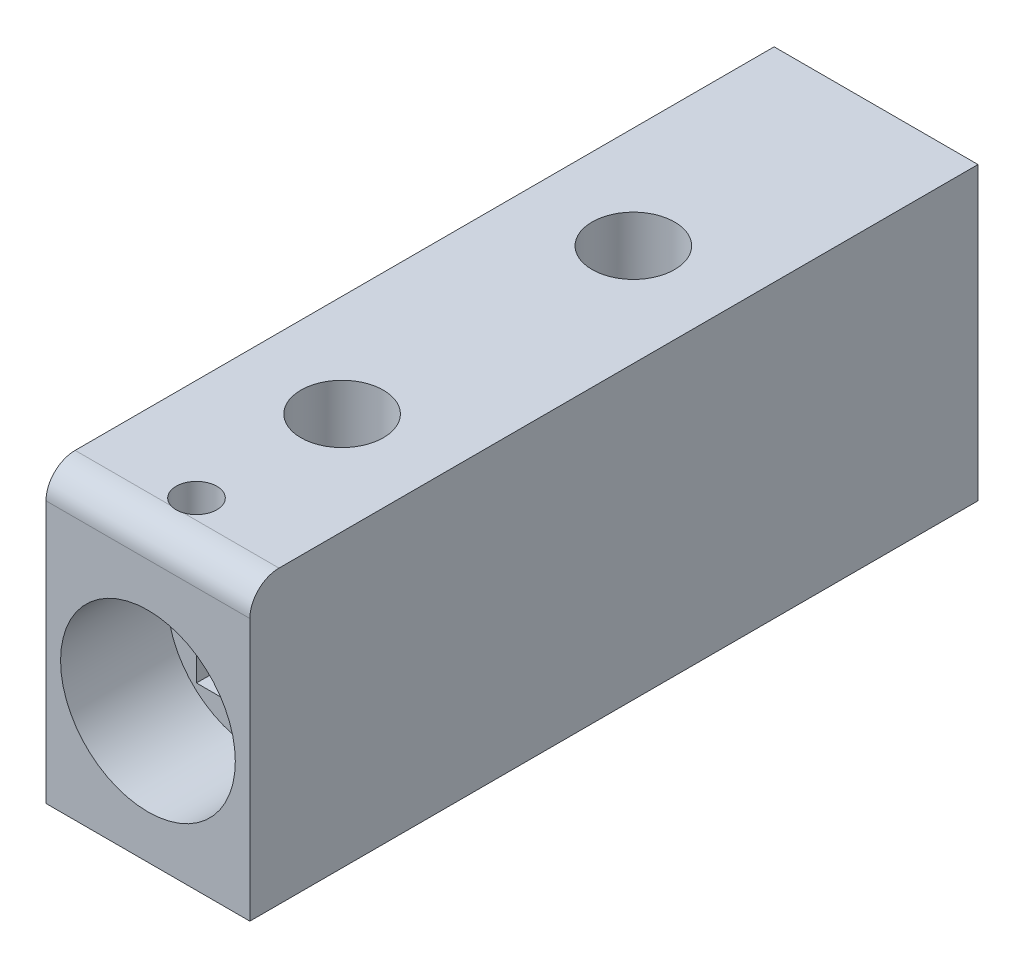
ISO-10303-21;
HEADER;
FILE_DESCRIPTION(('STEP AP214'),'2;1');
FILE_NAME('part.step','',(''),(''),'','','');
FILE_SCHEMA(('AUTOMOTIVE_DESIGN { 1 0 10303 214 1 1 1 1 }'));
ENDSEC;
DATA;
#1=APPLICATION_CONTEXT('core data for automotive mechanical design processes');
#2=APPLICATION_PROTOCOL_DEFINITION('international standard','automotive_design',2000,#1);
#3=PRODUCT_CONTEXT('',#1,'mechanical');
#4=PRODUCT('Part','Part','',(#3));
#5=PRODUCT_RELATED_PRODUCT_CATEGORY('part','',(#4));
#6=PRODUCT_DEFINITION_FORMATION('','',#4);
#7=PRODUCT_DEFINITION_CONTEXT('part definition',#1,'design');
#8=PRODUCT_DEFINITION('design','',#6,#7);
#9=PRODUCT_DEFINITION_SHAPE('','',#8);
#10=(LENGTH_UNIT() NAMED_UNIT(*) SI_UNIT(.MILLI.,.METRE.));
#11=(NAMED_UNIT(*) PLANE_ANGLE_UNIT() SI_UNIT($,.RADIAN.));
#12=(NAMED_UNIT(*) SI_UNIT($,.STERADIAN.) SOLID_ANGLE_UNIT());
#13=UNCERTAINTY_MEASURE_WITH_UNIT(LENGTH_MEASURE(1.E-05),#10,'distance_accuracy_value','');
#14=(GEOMETRIC_REPRESENTATION_CONTEXT(3) GLOBAL_UNCERTAINTY_ASSIGNED_CONTEXT((#13)) GLOBAL_UNIT_ASSIGNED_CONTEXT((#10,
#11,#12)) REPRESENTATION_CONTEXT('',''));
#15=CARTESIAN_POINT('',(0.,0.,0.));
#16=DIRECTION('',(0.,0.,1.));
#17=DIRECTION('',(1.,0.,0.));
#18=AXIS2_PLACEMENT_3D('',#15,#16,#17);
#19=CARTESIAN_POINT('',(10.5,30.,-75.));
#20=DIRECTION('',(1.,0.,0.));
#21=DIRECTION('',(0.,1.,0.));
#22=AXIS2_PLACEMENT_3D('',#19,#20,#21);
#23=PLANE('',#22);
#24=DIRECTION('',(0.,0.,1.));
#25=VECTOR('',#24,1.);
#26=CARTESIAN_POINT('',(10.5,30.,-75.));
#27=LINE('',#26,#25);
#28=CARTESIAN_POINT('',(10.5,30.,-75.));
#29=VERTEX_POINT('',#28);
#30=CARTESIAN_POINT('',(10.5,30.,-3.));
#31=VERTEX_POINT('',#30);
#32=EDGE_CURVE('E146',#29,#31,#27,.T.);
#33=ORIENTED_EDGE('',*,*,#32,.T.);
#34=CARTESIAN_POINT('',(10.5,27.,-3.));
#35=DIRECTION('',(1.,0.,0.));
#36=DIRECTION('',(0.,1.,0.));
#37=AXIS2_PLACEMENT_3D('',#34,#35,#36);
#38=CIRCLE('',#37,3.);
#39=CARTESIAN_POINT('',(10.5,27.,0.));
#40=VERTEX_POINT('',#39);
#41=EDGE_CURVE('E11',#31,#40,#38,.T.);
#42=ORIENTED_EDGE('',*,*,#41,.T.);
#43=DIRECTION('',(0.,1.,0.));
#44=VECTOR('',#43,1.);
#45=CARTESIAN_POINT('',(10.5,30.,0.));
#46=LINE('',#45,#44);
#47=CARTESIAN_POINT('',(10.5,0.,0.));
#48=VERTEX_POINT('',#47);
#49=EDGE_CURVE('E144',#48,#40,#46,.T.);
#50=ORIENTED_EDGE('',*,*,#49,.F.);
#51=DIRECTION('',(0.,0.,1.));
#52=VECTOR('',#51,1.);
#53=CARTESIAN_POINT('',(10.5,0.,-75.));
#54=LINE('',#53,#52);
#55=CARTESIAN_POINT('',(10.5,0.,-75.));
#56=VERTEX_POINT('',#55);
#57=EDGE_CURVE('E140',#56,#48,#54,.T.);
#58=ORIENTED_EDGE('',*,*,#57,.F.);
#59=DIRECTION('',(0.,1.,0.));
#60=VECTOR('',#59,1.);
#61=CARTESIAN_POINT('',(10.5,30.,-75.));
#62=LINE('',#61,#60);
#63=EDGE_CURVE('E158',#56,#29,#62,.T.);
#64=ORIENTED_EDGE('',*,*,#63,.T.);
#65=EDGE_LOOP('',(#33,#42,#50,#58,#64));
#66=FACE_BOUND('',#65,.T.);
#67=ADVANCED_FACE('F45',(#66),#23,.T.);
#68=CARTESIAN_POINT('',(-10.5,0.,-75.));
#69=DIRECTION('',(0.,-1.,0.));
#70=DIRECTION('',(1.,0.,0.));
#71=AXIS2_PLACEMENT_3D('',#68,#69,#70);
#72=PLANE('',#71);
#73=DIRECTION('',(1.,0.,0.));
#74=VECTOR('',#73,1.);
#75=CARTESIAN_POINT('',(-10.5,0.,0.));
#76=LINE('',#75,#74);
#77=CARTESIAN_POINT('',(-10.5,0.,0.));
#78=VERTEX_POINT('',#77);
#79=EDGE_CURVE('E155',#78,#48,#76,.T.);
#80=ORIENTED_EDGE('',*,*,#79,.F.);
#81=DIRECTION('',(0.,0.,1.));
#82=VECTOR('',#81,1.);
#83=CARTESIAN_POINT('',(-10.5,0.,-75.));
#84=LINE('',#83,#82);
#85=CARTESIAN_POINT('',(-10.5,0.,-75.));
#86=VERTEX_POINT('',#85);
#87=EDGE_CURVE('E151',#86,#78,#84,.T.);
#88=ORIENTED_EDGE('',*,*,#87,.F.);
#89=DIRECTION('',(1.,0.,0.));
#90=VECTOR('',#89,1.);
#91=CARTESIAN_POINT('',(-10.5,0.,-75.));
#92=LINE('',#91,#90);
#93=EDGE_CURVE('E149',#86,#56,#92,.T.);
#94=ORIENTED_EDGE('',*,*,#93,.T.);
#95=ORIENTED_EDGE('',*,*,#57,.T.);
#96=EDGE_LOOP('',(#80,#88,#94,#95));
#97=FACE_BOUND('',#96,.T.);
#98=ADVANCED_FACE('F255',(#97),#72,.T.);
#99=CARTESIAN_POINT('',(-10.5,30.,-75.));
#100=DIRECTION('',(-1.,0.,0.));
#101=DIRECTION('',(0.,-1.,0.));
#102=AXIS2_PLACEMENT_3D('',#99,#100,#101);
#103=PLANE('',#102);
#104=DIRECTION('',(0.,-1.,0.));
#105=VECTOR('',#104,1.);
#106=CARTESIAN_POINT('',(-10.5,30.,0.));
#107=LINE('',#106,#105);
#108=CARTESIAN_POINT('',(-10.5,27.,0.));
#109=VERTEX_POINT('',#108);
#110=EDGE_CURVE('E159',#109,#78,#107,.T.);
#111=ORIENTED_EDGE('',*,*,#110,.F.);
#112=CARTESIAN_POINT('',(-10.5,27.,-3.));
#113=DIRECTION('',(-1.,0.,0.));
#114=DIRECTION('',(0.,-1.,0.));
#115=AXIS2_PLACEMENT_3D('',#112,#113,#114);
#116=CIRCLE('',#115,3.);
#117=CARTESIAN_POINT('',(-10.5,30.,-3.));
#118=VERTEX_POINT('',#117);
#119=EDGE_CURVE('E134',#109,#118,#116,.T.);
#120=ORIENTED_EDGE('',*,*,#119,.T.);
#121=DIRECTION('',(0.,0.,1.));
#122=VECTOR('',#121,1.);
#123=CARTESIAN_POINT('',(-10.5,30.,-75.));
#124=LINE('',#123,#122);
#125=CARTESIAN_POINT('',(-10.5,30.,-75.));
#126=VERTEX_POINT('',#125);
#127=EDGE_CURVE('E148',#126,#118,#124,.T.);
#128=ORIENTED_EDGE('',*,*,#127,.F.);
#129=DIRECTION('',(0.,-1.,0.));
#130=VECTOR('',#129,1.);
#131=CARTESIAN_POINT('',(-10.5,30.,-75.));
#132=LINE('',#131,#130);
#133=EDGE_CURVE('E165',#126,#86,#132,.T.);
#134=ORIENTED_EDGE('',*,*,#133,.T.);
#135=ORIENTED_EDGE('',*,*,#87,.T.);
#136=EDGE_LOOP('',(#111,#120,#128,#134,#135));
#137=FACE_BOUND('',#136,.T.);
#138=ADVANCED_FACE('F258',(#137),#103,.T.);
#139=CARTESIAN_POINT('',(-10.5,30.,-75.));
#140=DIRECTION('',(0.,1.,0.));
#141=DIRECTION('',(-1.,0.,0.));
#142=AXIS2_PLACEMENT_3D('',#139,#140,#141);
#143=PLANE('',#142);
#144=CARTESIAN_POINT('',(0.,30.,-20.));
#145=DIRECTION('',(0.,1.,0.));
#146=DIRECTION('',(0.,0.,1.));
#147=AXIS2_PLACEMENT_3D('',#144,#145,#146);
#148=CIRCLE('',#147,4.25);
#149=CARTESIAN_POINT('',(0.,30.,-15.75));
#150=VERTEX_POINT('',#149);
#151=EDGE_CURVE('E401',#150,#150,#148,.T.);
#152=ORIENTED_EDGE('',*,*,#151,.F.);
#153=EDGE_LOOP('',(#152));
#154=FACE_BOUND('',#153,.T.);
#155=CARTESIAN_POINT('',(0.,30.,-50.));
#156=DIRECTION('',(0.,1.,0.));
#157=DIRECTION('',(0.,0.,1.));
#158=AXIS2_PLACEMENT_3D('',#155,#156,#157);
#159=CIRCLE('',#158,4.25);
#160=CARTESIAN_POINT('',(0.,30.,-45.75));
#161=VERTEX_POINT('',#160);
#162=EDGE_CURVE('E403',#161,#161,#159,.T.);
#163=ORIENTED_EDGE('',*,*,#162,.F.);
#164=EDGE_LOOP('',(#163));
#165=FACE_BOUND('',#164,.T.);
#166=CARTESIAN_POINT('',(0.,30.,-5.));
#167=DIRECTION('',(0.,1.,0.));
#168=DIRECTION('',(0.,0.,1.));
#169=AXIS2_PLACEMENT_3D('',#166,#167,#168);
#170=CIRCLE('',#169,2.1);
#171=CARTESIAN_POINT('',(0.640312423743279,30.,-3.));
#172=VERTEX_POINT('',#171);
#173=CARTESIAN_POINT('',(-0.64031242374329,30.,-3.));
#174=VERTEX_POINT('',#173);
#175=EDGE_CURVE('E60',#172,#174,#170,.T.);
#176=ORIENTED_EDGE('',*,*,#175,.F.);
#177=DIRECTION('',(-1.,0.,0.));
#178=VECTOR('',#177,1.);
#179=CARTESIAN_POINT('',(-10.5,30.,-3.));
#180=LINE('',#179,#178);
#181=EDGE_CURVE('E67',#172,#31,#180,.F.);
#182=ORIENTED_EDGE('',*,*,#181,.T.);
#183=ORIENTED_EDGE('',*,*,#32,.F.);
#184=DIRECTION('',(-1.,0.,0.));
#185=VECTOR('',#184,1.);
#186=CARTESIAN_POINT('',(-10.5,30.,-75.));
#187=LINE('',#186,#185);
#188=EDGE_CURVE('E168',#29,#126,#187,.T.);
#189=ORIENTED_EDGE('',*,*,#188,.T.);
#190=ORIENTED_EDGE('',*,*,#127,.T.);
#191=EDGE_CURVE('E54',#118,#174,#180,.F.);
#192=ORIENTED_EDGE('',*,*,#191,.T.);
#193=EDGE_LOOP('',(#176,#182,#183,#189,#190,#192));
#194=FACE_BOUND('',#193,.T.);
#195=ADVANCED_FACE('F128',(#154,#165,#194),#143,.T.);
#196=CARTESIAN_POINT('',(0.,0.,-75.));
#197=DIRECTION('',(0.,0.,1.));
#198=DIRECTION('',(1.,0.,0.));
#199=AXIS2_PLACEMENT_3D('',#196,#197,#198);
#200=PLANE('',#199);
#201=DIRECTION('',(1.,0.,0.));
#202=VECTOR('',#201,1.);
#203=CARTESIAN_POINT('',(-6.,7.5,-75.));
#204=LINE('',#203,#202);
#205=CARTESIAN_POINT('',(-6.,7.5,-75.));
#206=VERTEX_POINT('',#205);
#207=CARTESIAN_POINT('',(6.,7.5,-75.));
#208=VERTEX_POINT('',#207);
#209=EDGE_CURVE('E179',#206,#208,#204,.T.);
#210=ORIENTED_EDGE('',*,*,#209,.T.);
#211=DIRECTION('',(0.,1.,0.));
#212=VECTOR('',#211,1.);
#213=CARTESIAN_POINT('',(6.,7.5,-75.));
#214=LINE('',#213,#212);
#215=CARTESIAN_POINT('',(6.,19.5,-75.));
#216=VERTEX_POINT('',#215);
#217=EDGE_CURVE('E188',#208,#216,#214,.T.);
#218=ORIENTED_EDGE('',*,*,#217,.T.);
#219=DIRECTION('',(-1.,0.,0.));
#220=VECTOR('',#219,1.);
#221=CARTESIAN_POINT('',(-6.,19.5,-75.));
#222=LINE('',#221,#220);
#223=CARTESIAN_POINT('',(-6.,19.5,-75.));
#224=VERTEX_POINT('',#223);
#225=EDGE_CURVE('E201',#216,#224,#222,.T.);
#226=ORIENTED_EDGE('',*,*,#225,.T.);
#227=DIRECTION('',(0.,-1.,0.));
#228=VECTOR('',#227,1.);
#229=CARTESIAN_POINT('',(-6.,7.5,-75.));
#230=LINE('',#229,#228);
#231=EDGE_CURVE('E198',#224,#206,#230,.T.);
#232=ORIENTED_EDGE('',*,*,#231,.T.);
#233=EDGE_LOOP('',(#210,#218,#226,#232));
#234=FACE_BOUND('',#233,.T.);
#235=ORIENTED_EDGE('',*,*,#63,.F.);
#236=ORIENTED_EDGE('',*,*,#93,.F.);
#237=ORIENTED_EDGE('',*,*,#133,.F.);
#238=ORIENTED_EDGE('',*,*,#188,.F.);
#239=EDGE_LOOP('',(#235,#236,#237,#238));
#240=FACE_BOUND('',#239,.T.);
#241=ADVANCED_FACE('F248',(#234,#240),#200,.F.);
#242=CARTESIAN_POINT('',(0.,0.,0.));
#243=DIRECTION('',(0.,0.,1.));
#244=DIRECTION('',(1.,0.,0.));
#245=AXIS2_PLACEMENT_3D('',#242,#243,#244);
#246=PLANE('',#245);
#247=CARTESIAN_POINT('',(0.,13.5,0.));
#248=DIRECTION('',(0.,0.,1.));
#249=DIRECTION('',(1.,0.,0.));
#250=AXIS2_PLACEMENT_3D('',#247,#248,#249);
#251=CIRCLE('',#250,9.);
#252=CARTESIAN_POINT('',(9.,13.5,0.));
#253=VERTEX_POINT('',#252);
#254=EDGE_CURVE('E141',#253,#253,#251,.F.);
#255=ORIENTED_EDGE('',*,*,#254,.T.);
#256=EDGE_LOOP('',(#255));
#257=FACE_BOUND('',#256,.T.);
#258=ORIENTED_EDGE('',*,*,#49,.T.);
#259=DIRECTION('',(-1.,0.,0.));
#260=VECTOR('',#259,1.);
#261=CARTESIAN_POINT('',(0.,27.,0.));
#262=LINE('',#261,#260);
#263=EDGE_CURVE('E135',#40,#109,#262,.T.);
#264=ORIENTED_EDGE('',*,*,#263,.T.);
#265=ORIENTED_EDGE('',*,*,#110,.T.);
#266=ORIENTED_EDGE('',*,*,#79,.T.);
#267=EDGE_LOOP('',(#258,#264,#265,#266));
#268=FACE_BOUND('',#267,.T.);
#269=ADVANCED_FACE('F246',(#257,#268),#246,.T.);
#270=CARTESIAN_POINT('',(0.,13.5,1.2E-05));
#271=DIRECTION('',(0.,0.,-1.));
#272=DIRECTION('',(-1.,0.,0.));
#273=AXIS2_PLACEMENT_3D('',#270,#271,#272);
#274=CYLINDRICAL_SURFACE('',#273,9.);
#275=CARTESIAN_POINT('',(0.,22.5,-2.9));
#276=CARTESIAN_POINT('',(-0.116270482771296,22.4999979069311,-2.90000367425328));
#277=CARTESIAN_POINT('',(-0.232583778270632,22.49772416581,-2.90968886156538));
#278=CARTESIAN_POINT('',(-0.461893067534111,22.4888736766601,-2.94812549196073));
#279=CARTESIAN_POINT('',(-0.574886863108166,22.4822941415624,-2.97688928447222));
#280=CARTESIAN_POINT('',(-0.794211203729724,22.4655628470686,-3.05252253463005));
#281=CARTESIAN_POINT('',(-0.900549030839804,22.4554150749746,-3.0993717884954));
#282=CARTESIAN_POINT('',(-1.10385368433182,22.4326359579363,-3.20977874892187));
#283=CARTESIAN_POINT('',(-1.20082049651012,22.4200046092278,-3.27333648080746));
#284=CARTESIAN_POINT('',(-1.38438893887319,22.3933806608296,-3.4165735399717));
#285=CARTESIAN_POINT('',(-1.47079656869454,22.3793692790304,-3.49649801925577));
#286=CARTESIAN_POINT('',(-1.62910985770604,22.3516932992599,-3.66967415465357));
#287=CARTESIAN_POINT('',(-1.70101407589094,22.3380287358648,-3.76292713346646));
#288=CARTESIAN_POINT('',(-1.82916077598461,22.3124065725647,-3.96158002557307));
#289=CARTESIAN_POINT('',(-1.88519200065477,22.3004729438296,-4.06711958648676));
#290=CARTESIAN_POINT('',(-1.97864555557152,22.2799354518056,-4.28644203310331));
#291=CARTESIAN_POINT('',(-2.01607044443044,22.27133113073,-4.40022378293157));
#292=CARTESIAN_POINT('',(-2.07059844665284,22.2586185938141,-4.63068292650073));
#293=CARTESIAN_POINT('',(-2.08804750528012,22.2544339394324,-4.74727415734885));
#294=CARTESIAN_POINT('',(-2.10320509139726,22.2508053257674,-4.98179841333567));
#295=CARTESIAN_POINT('',(-2.10091639510568,22.2513606997742,-5.0997312474405));
#296=CARTESIAN_POINT('',(-2.0769407551021,22.2570804091111,-5.33098384571856));
#297=CARTESIAN_POINT('',(-2.05566028697392,22.2621481620844,-5.44434850795902));
#298=CARTESIAN_POINT('',(-1.99495115818445,22.2761683747317,-5.66585278940971));
#299=CARTESIAN_POINT('',(-1.9555213543927,22.2851210790961,-5.7739920790273));
#300=CARTESIAN_POINT('',(-1.85927182963291,22.3059946594555,-5.98309472734648));
#301=CARTESIAN_POINT('',(-1.80229980082799,22.317941354253,-6.08398529397549));
#302=CARTESIAN_POINT('',(-1.67268987149991,22.3434415694815,-6.27492266915778));
#303=CARTESIAN_POINT('',(-1.6000495591666,22.3569953371435,-6.36496780495079));
#304=CARTESIAN_POINT('',(-1.43903418153237,22.3845934658101,-6.53399373688632));
#305=CARTESIAN_POINT('',(-1.35031462598566,22.3986416731073,-6.61264610513689));
#306=CARTESIAN_POINT('',(-1.16078098583346,22.4253421360926,-6.75401378684927));
#307=CARTESIAN_POINT('',(-1.05996661948874,22.4379943592492,-6.81672872895493));
#308=CARTESIAN_POINT('',(-0.848673760476629,22.4605276999368,-6.92454003763603));
#309=CARTESIAN_POINT('',(-0.738170088604823,22.4704012989627,-6.96958872922549));
#310=CARTESIAN_POINT('',(-0.510878422765306,22.4862096792902,-7.04038356719761));
#311=CARTESIAN_POINT('',(-0.394091475459281,22.4921451144245,-7.06613291784047));
#312=CARTESIAN_POINT('',(-0.160361382690048,22.4993136660416,-7.09710970449861));
#313=CARTESIAN_POINT('',(-0.0434806749828665,22.5006494157481,-7.10278513142171));
#314=CARTESIAN_POINT('',(0.18955926829311,22.4987578257406,-7.09467374805388));
#315=CARTESIAN_POINT('',(0.305718559246018,22.4955308407741,-7.0808884508126));
#316=CARTESIAN_POINT('',(0.532501284230128,22.4849416028821,-7.03461754245816));
#317=CARTESIAN_POINT('',(0.643176222996088,22.4776322819214,-7.00237116803738));
#318=CARTESIAN_POINT('',(0.857543849316164,22.4596986028195,-6.92036247894844));
#319=CARTESIAN_POINT('',(0.961235887574998,22.4490739369216,-6.87059853810544));
#320=CARTESIAN_POINT('',(1.16051529844914,22.4254379376066,-6.7540635476818));
#321=CARTESIAN_POINT('',(1.25594772133985,22.4123913653529,-6.68703484021642));
#322=CARTESIAN_POINT('',(1.43437018543801,22.3854228141331,-6.53820771835372));
#323=CARTESIAN_POINT('',(1.51735836809635,22.3715007048451,-6.45640710178295));
#324=CARTESIAN_POINT('',(1.67034215780755,22.3439888047978,-6.27829055668902));
#325=CARTESIAN_POINT('',(1.74002558845952,22.3304122848168,-6.18170404580447));
#326=CARTESIAN_POINT('',(1.86218801628622,22.305461868571,-5.97793878253686));
#327=CARTESIAN_POINT('',(1.91466778097558,22.2940878740533,-5.87076050296671));
#328=CARTESIAN_POINT('',(2.00055801810582,22.2749475819543,-5.64943931000558));
#329=CARTESIAN_POINT('',(2.03407988610504,22.2671602605551,-5.53534153729492));
#330=CARTESIAN_POINT('',(2.08141649114138,22.2560440588381,-5.30292427437427));
#331=CARTESIAN_POINT('',(2.09523488954185,22.252714350199,-5.1846055727008));
#332=CARTESIAN_POINT('',(2.10260008651045,22.2509476002078,-4.95026517575));
#333=CARTESIAN_POINT('',(2.09664352415427,22.2523906887767,-4.83425972532685));
#334=CARTESIAN_POINT('',(2.06575006242284,22.2597331022539,-4.60495544031369));
#335=CARTESIAN_POINT('',(2.04081345391001,22.2656323588731,-4.49165656427384));
#336=CARTESIAN_POINT('',(1.97292227427207,22.2811601012467,-4.27144176430943));
#337=CARTESIAN_POINT('',(1.93004943720438,22.2907716552704,-4.16449936782233));
#338=CARTESIAN_POINT('',(1.82756980261904,22.3126455601281,-3.95925500607232));
#339=CARTESIAN_POINT('',(1.76796099211833,22.3249082297943,-3.86095408206424));
#340=CARTESIAN_POINT('',(1.63209515201212,22.3510534148006,-3.67335634537734));
#341=CARTESIAN_POINT('',(1.55548832622459,22.3649665796007,-3.58431709386511));
#342=CARTESIAN_POINT('',(1.3884978569793,22.3926499650442,-3.42019540758775));
#343=CARTESIAN_POINT('',(1.29811100193217,22.4064201515637,-3.34511623545214));
#344=CARTESIAN_POINT('',(1.10446706420138,22.4325153682366,-3.20994228107424));
#345=CARTESIAN_POINT('',(1.00103507802072,22.4448152212635,-3.15009287915445));
#346=CARTESIAN_POINT('',(0.785307395531293,22.4663260221027,-3.04872564707065));
#347=CARTESIAN_POINT('',(0.673018734058403,22.4755393915764,-3.00719343706313));
#348=CARTESIAN_POINT('',(0.467292276271287,22.4883208873433,-2.95048967659163));
#349=CARTESIAN_POINT('',(0.374911422864423,22.4926721191901,-2.93159427817839));
#350=CARTESIAN_POINT('',(0.188363011400006,22.4985124419216,-2.90634830849423));
#351=CARTESIAN_POINT('',(0.0941955553264274,22.5000016956821,-2.89999702333456));
#352=CARTESIAN_POINT('',(0.,22.5,-2.9));
#353=B_SPLINE_CURVE_WITH_KNOTS('',3,(#275,#276,#277,#278,#279,#280,#281,#282,#283,#284,#285,
#286,#287,#288,#289,#290,#291,#292,#293,#294,#295,#296,#297,#298,#299,#300,#301,#302,#303,#304,
#305,#306,#307,#308,#309,#310,#311,#312,#313,#314,#315,#316,#317,#318,#319,#320,#321,#322,#323,
#324,#325,#326,#327,#328,#329,#330,#331,#332,#333,#334,#335,#336,#337,#338,#339,#340,#341,#342,
#343,#344,#345,#346,#347,#348,#349,#350,#351,#352),.UNSPECIFIED.,.T.,.F.,(4,2,2,2,2,2,2,2,2,2,2,
2,2,2,2,2,2,2,2,2,2,2,2,2,2,2,2,2,2,2,2,2,2,2,2,2,2,2,4),(0.,0.348466478879037,
0.697158737725428,1.04546258459426,1.39376695937821,1.74773027157475,2.10172873495005,
2.46023827430178,2.81869850030005,3.17085218877342,3.52295634579486,3.86770057789557,
4.21246652658029,4.56031454541877,4.9082161465687,5.26471547109128,5.62122310160243,
5.97868630678437,6.33609014936903,6.68546563108269,7.03481395073765,7.37973436244265,
7.72468680193442,8.0751200868535,8.42560565701933,8.7835095384404,9.14139745036613,
9.49715998077892,9.85285639361189,10.1996879051154,10.5465141016571,10.8917767616241,
11.2370809671781,11.5902879607255,11.9435773992963,12.3022423880077,12.6606253047182,
12.9429485641595,13.2252557560478),.UNSPECIFIED.);
#354=CARTESIAN_POINT('',(0.,22.5,-2.9));
#355=VERTEX_POINT('',#354);
#356=EDGE_CURVE('E126',#355,#355,#353,.T.);
#357=ORIENTED_EDGE('',*,*,#356,.F.);
#358=EDGE_LOOP('',(#357));
#359=FACE_BOUND('',#358,.T.);
#360=ORIENTED_EDGE('',*,*,#254,.F.);
#361=EDGE_LOOP('',(#360));
#362=FACE_BOUND('',#361,.T.);
#363=CARTESIAN_POINT('',(0.,13.5,-11.));
#364=DIRECTION('',(0.,0.,1.));
#365=DIRECTION('',(1.,0.,0.));
#366=AXIS2_PLACEMENT_3D('',#363,#364,#365);
#367=CIRCLE('',#366,9.);
#368=CARTESIAN_POINT('',(9.,13.5,-11.));
#369=VERTEX_POINT('',#368);
#370=EDGE_CURVE('E145',#369,#369,#367,.T.);
#371=ORIENTED_EDGE('',*,*,#370,.F.);
#372=EDGE_LOOP('',(#371));
#373=FACE_BOUND('',#372,.T.);
#374=ADVANCED_FACE('F242',(#359,#362,#373),#274,.F.);
#375=CARTESIAN_POINT('',(0.,13.5,-11.));
#376=DIRECTION('',(0.,0.,1.));
#377=DIRECTION('',(1.,0.,0.));
#378=AXIS2_PLACEMENT_3D('',#375,#376,#377);
#379=PLANE('',#378);
#380=DIRECTION('',(0.,1.,0.));
#381=VECTOR('',#380,1.);
#382=CARTESIAN_POINT('',(6.,7.5,-11.));
#383=LINE('',#382,#381);
#384=CARTESIAN_POINT('',(6.,7.5,-11.));
#385=VERTEX_POINT('',#384);
#386=CARTESIAN_POINT('',(6.,19.5,-11.));
#387=VERTEX_POINT('',#386);
#388=EDGE_CURVE('E125',#385,#387,#383,.T.);
#389=ORIENTED_EDGE('',*,*,#388,.F.);
#390=DIRECTION('',(1.,0.,0.));
#391=VECTOR('',#390,1.);
#392=CARTESIAN_POINT('',(-6.,7.5,-11.));
#393=LINE('',#392,#391);
#394=CARTESIAN_POINT('',(-6.,7.5,-11.));
#395=VERTEX_POINT('',#394);
#396=EDGE_CURVE('E185',#395,#385,#393,.T.);
#397=ORIENTED_EDGE('',*,*,#396,.F.);
#398=DIRECTION('',(0.,-1.,0.));
#399=VECTOR('',#398,1.);
#400=CARTESIAN_POINT('',(-6.,7.5,-11.));
#401=LINE('',#400,#399);
#402=CARTESIAN_POINT('',(-6.,19.5,-11.));
#403=VERTEX_POINT('',#402);
#404=EDGE_CURVE('E189',#403,#395,#401,.T.);
#405=ORIENTED_EDGE('',*,*,#404,.F.);
#406=DIRECTION('',(-1.,0.,0.));
#407=VECTOR('',#406,1.);
#408=CARTESIAN_POINT('',(-6.,19.5,-11.));
#409=LINE('',#408,#407);
#410=EDGE_CURVE('E191',#387,#403,#409,.T.);
#411=ORIENTED_EDGE('',*,*,#410,.F.);
#412=EDGE_LOOP('',(#389,#397,#405,#411));
#413=FACE_BOUND('',#412,.T.);
#414=ORIENTED_EDGE('',*,*,#370,.T.);
#415=EDGE_LOOP('',(#414));
#416=FACE_BOUND('',#415,.T.);
#417=ADVANCED_FACE('F238',(#413,#416),#379,.T.);
#418=CARTESIAN_POINT('',(6.,7.5,-75.));
#419=DIRECTION('',(1.,0.,0.));
#420=DIRECTION('',(0.,1.,0.));
#421=AXIS2_PLACEMENT_3D('',#418,#419,#420);
#422=PLANE('',#421);
#423=ORIENTED_EDGE('',*,*,#388,.T.);
#424=DIRECTION('',(0.,0.,1.));
#425=VECTOR('',#424,1.);
#426=CARTESIAN_POINT('',(6.,19.5,-75.));
#427=LINE('',#426,#425);
#428=EDGE_CURVE('E176',#216,#387,#427,.T.);
#429=ORIENTED_EDGE('',*,*,#428,.F.);
#430=ORIENTED_EDGE('',*,*,#217,.F.);
#431=DIRECTION('',(0.,0.,1.));
#432=VECTOR('',#431,1.);
#433=CARTESIAN_POINT('',(6.,7.5,-75.));
#434=LINE('',#433,#432);
#435=EDGE_CURVE('E175',#208,#385,#434,.T.);
#436=ORIENTED_EDGE('',*,*,#435,.T.);
#437=EDGE_LOOP('',(#423,#429,#430,#436));
#438=FACE_BOUND('',#437,.T.);
#439=ADVANCED_FACE('F227',(#438),#422,.F.);
#440=CARTESIAN_POINT('',(-6.,7.5,-75.));
#441=DIRECTION('',(0.,-1.,0.));
#442=DIRECTION('',(1.,0.,0.));
#443=AXIS2_PLACEMENT_3D('',#440,#441,#442);
#444=PLANE('',#443);
#445=ORIENTED_EDGE('',*,*,#396,.T.);
#446=ORIENTED_EDGE('',*,*,#435,.F.);
#447=ORIENTED_EDGE('',*,*,#209,.F.);
#448=DIRECTION('',(0.,0.,1.));
#449=VECTOR('',#448,1.);
#450=CARTESIAN_POINT('',(-6.,7.5,-75.));
#451=LINE('',#450,#449);
#452=EDGE_CURVE('E181',#206,#395,#451,.T.);
#453=ORIENTED_EDGE('',*,*,#452,.T.);
#454=EDGE_LOOP('',(#445,#446,#447,#453));
#455=FACE_BOUND('',#454,.T.);
#456=ADVANCED_FACE('F223',(#455),#444,.F.);
#457=CARTESIAN_POINT('',(-6.,7.5,-75.));
#458=DIRECTION('',(-1.,0.,0.));
#459=DIRECTION('',(0.,0.,1.));
#460=AXIS2_PLACEMENT_3D('',#457,#458,#459);
#461=PLANE('',#460);
#462=ORIENTED_EDGE('',*,*,#404,.T.);
#463=ORIENTED_EDGE('',*,*,#452,.F.);
#464=ORIENTED_EDGE('',*,*,#231,.F.);
#465=DIRECTION('',(0.,0.,1.));
#466=VECTOR('',#465,1.);
#467=CARTESIAN_POINT('',(-6.,19.5,-75.));
#468=LINE('',#467,#466);
#469=EDGE_CURVE('E178',#224,#403,#468,.T.);
#470=ORIENTED_EDGE('',*,*,#469,.T.);
#471=EDGE_LOOP('',(#462,#463,#464,#470));
#472=FACE_BOUND('',#471,.T.);
#473=ADVANCED_FACE('F226',(#472),#461,.F.);
#474=CARTESIAN_POINT('',(-6.,19.5,-75.));
#475=DIRECTION('',(0.,1.,0.));
#476=DIRECTION('',(-1.,0.,0.));
#477=AXIS2_PLACEMENT_3D('',#474,#475,#476);
#478=PLANE('',#477);
#479=CARTESIAN_POINT('',(0.,19.5,-20.));
#480=DIRECTION('',(0.,1.,0.));
#481=DIRECTION('',(-1.,0.,0.));
#482=AXIS2_PLACEMENT_3D('',#479,#480,#481);
#483=CIRCLE('',#482,4.25);
#484=CARTESIAN_POINT('',(-4.25,19.5,-20.));
#485=VERTEX_POINT('',#484);
#486=EDGE_CURVE('E398',#485,#485,#483,.T.);
#487=ORIENTED_EDGE('',*,*,#486,.T.);
#488=EDGE_LOOP('',(#487));
#489=FACE_BOUND('',#488,.T.);
#490=CARTESIAN_POINT('',(0.,19.5,-50.));
#491=DIRECTION('',(0.,1.,0.));
#492=DIRECTION('',(-1.,0.,0.));
#493=AXIS2_PLACEMENT_3D('',#490,#491,#492);
#494=CIRCLE('',#493,4.25);
#495=CARTESIAN_POINT('',(-4.25,19.5,-50.));
#496=VERTEX_POINT('',#495);
#497=EDGE_CURVE('E130',#496,#496,#494,.T.);
#498=ORIENTED_EDGE('',*,*,#497,.T.);
#499=EDGE_LOOP('',(#498));
#500=FACE_BOUND('',#499,.T.);
#501=ORIENTED_EDGE('',*,*,#410,.T.);
#502=ORIENTED_EDGE('',*,*,#469,.F.);
#503=ORIENTED_EDGE('',*,*,#225,.F.);
#504=ORIENTED_EDGE('',*,*,#428,.T.);
#505=EDGE_LOOP('',(#501,#502,#503,#504));
#506=FACE_BOUND('',#505,.T.);
#507=ADVANCED_FACE('F231',(#489,#500,#506),#478,.F.);
#508=CARTESIAN_POINT('',(0.,27.,-3.));
#509=DIRECTION('',(-1.,0.,0.));
#510=DIRECTION('',(0.,-1.,0.));
#511=AXIS2_PLACEMENT_3D('',#508,#509,#510);
#512=CYLINDRICAL_SURFACE('',#511,3.);
#513=CARTESIAN_POINT('',(-0.640312423743289,30.,-3.));
#514=CARTESIAN_POINT('',(-0.583364057833237,29.9999876797797,-2.98176119629366));
#515=CARTESIAN_POINT('',(-0.525635503952818,29.9998331747282,-2.9659672142846));
#516=CARTESIAN_POINT('',(-0.409039541996115,29.9994197963793,-2.93935544094292));
#517=CARTESIAN_POINT('',(-0.350172073378095,29.9991609175191,-2.92853791490726));
#518=CARTESIAN_POINT('',(-0.233230078511109,29.998724446575,-2.91217798595373));
#519=CARTESIAN_POINT('',(-0.175173384804916,29.9985449570005,-2.9065085861098));
#520=CARTESIAN_POINT('',(-0.0588136090971193,29.9983347832077,-2.90001432614997));
#521=CARTESIAN_POINT('',(-0.000510571278853887,29.9983040733515,-2.89918863135933));
#522=CARTESIAN_POINT('',(0.155440949657763,29.9984517783396,-2.90348644069029));
#523=CARTESIAN_POINT('',(0.253018079517231,29.9987857587047,-2.91301353651908));
#524=CARTESIAN_POINT('',(0.39863483312503,29.9993604082296,-2.93757542518433));
#525=CARTESIAN_POINT('',(0.447575473123465,29.999566895274,-2.94764202998694));
#526=CARTESIAN_POINT('',(0.544622450431753,29.9998847037734,-2.97123762389317));
#527=CARTESIAN_POINT('',(0.592728670059995,29.9999960119101,-2.9847670972069));
#528=CARTESIAN_POINT('',(0.640312423743279,30.,-3.));
#529=B_SPLINE_CURVE_WITH_KNOTS('',3,(#513,#514,#515,#516,#517,#518,#519,#520,#521,#522,#523,
#524,#525,#526,#527,#528),.UNSPECIFIED.,.F.,.F.,(4,2,2,2,2,2,2,4),(0.,0.179334421196441,
0.358678401678686,0.533467506775253,0.708226491058359,1.0012365770896,1.15102807434323,
1.30084052827488),.UNSPECIFIED.);
#530=EDGE_CURVE('E119',#174,#172,#529,.T.);
#531=ORIENTED_EDGE('',*,*,#530,.F.);
#532=ORIENTED_EDGE('',*,*,#191,.F.);
#533=ORIENTED_EDGE('',*,*,#119,.F.);
#534=ORIENTED_EDGE('',*,*,#263,.F.);
#535=ORIENTED_EDGE('',*,*,#41,.F.);
#536=ORIENTED_EDGE('',*,*,#181,.F.);
#537=EDGE_LOOP('',(#531,#532,#533,#534,#535,#536));
#538=FACE_BOUND('',#537,.T.);
#539=ADVANCED_FACE('F47',(#538),#512,.T.);
#540=CARTESIAN_POINT('',(0.,30.,-5.));
#541=DIRECTION('',(0.,1.,0.));
#542=DIRECTION('',(0.,0.,1.));
#543=AXIS2_PLACEMENT_3D('',#540,#541,#542);
#544=CYLINDRICAL_SURFACE('',#543,2.1);
#545=ORIENTED_EDGE('',*,*,#530,.T.);
#546=ORIENTED_EDGE('',*,*,#175,.T.);
#547=EDGE_LOOP('',(#545,#546));
#548=FACE_BOUND('',#547,.T.);
#549=ORIENTED_EDGE('',*,*,#356,.T.);
#550=EDGE_LOOP('',(#549));
#551=FACE_BOUND('',#550,.T.);
#552=ADVANCED_FACE('F120',(#548,#551),#544,.F.);
#553=CARTESIAN_POINT('',(0.,30.,-50.));
#554=DIRECTION('',(0.,1.,0.));
#555=DIRECTION('',(0.,0.,1.));
#556=AXIS2_PLACEMENT_3D('',#553,#554,#555);
#557=CYLINDRICAL_SURFACE('',#556,4.25);
#558=ORIENTED_EDGE('',*,*,#497,.F.);
#559=EDGE_LOOP('',(#558));
#560=FACE_BOUND('',#559,.T.);
#561=ORIENTED_EDGE('',*,*,#162,.T.);
#562=EDGE_LOOP('',(#561));
#563=FACE_BOUND('',#562,.T.);
#564=ADVANCED_FACE('F218',(#560,#563),#557,.F.);
#565=CARTESIAN_POINT('',(0.,30.,-20.));
#566=DIRECTION('',(0.,1.,0.));
#567=DIRECTION('',(0.,0.,1.));
#568=AXIS2_PLACEMENT_3D('',#565,#566,#567);
#569=CYLINDRICAL_SURFACE('',#568,4.25);
#570=ORIENTED_EDGE('',*,*,#486,.F.);
#571=EDGE_LOOP('',(#570));
#572=FACE_BOUND('',#571,.T.);
#573=ORIENTED_EDGE('',*,*,#151,.T.);
#574=EDGE_LOOP('',(#573));
#575=FACE_BOUND('',#574,.T.);
#576=ADVANCED_FACE('F335',(#572,#575),#569,.F.);
#577=CLOSED_SHELL('',(#67,#98,#138,#195,#241,#269,#374,#417,#439,#456,#473,#507,#539,#552,#564,#576));
#578=MANIFOLD_SOLID_BREP('B2',#577);
#579=ADVANCED_BREP_SHAPE_REPRESENTATION('',(#18,#578),#14);
#580=SHAPE_DEFINITION_REPRESENTATION(#9,#579);
ENDSEC;
END-ISO-10303-21;
